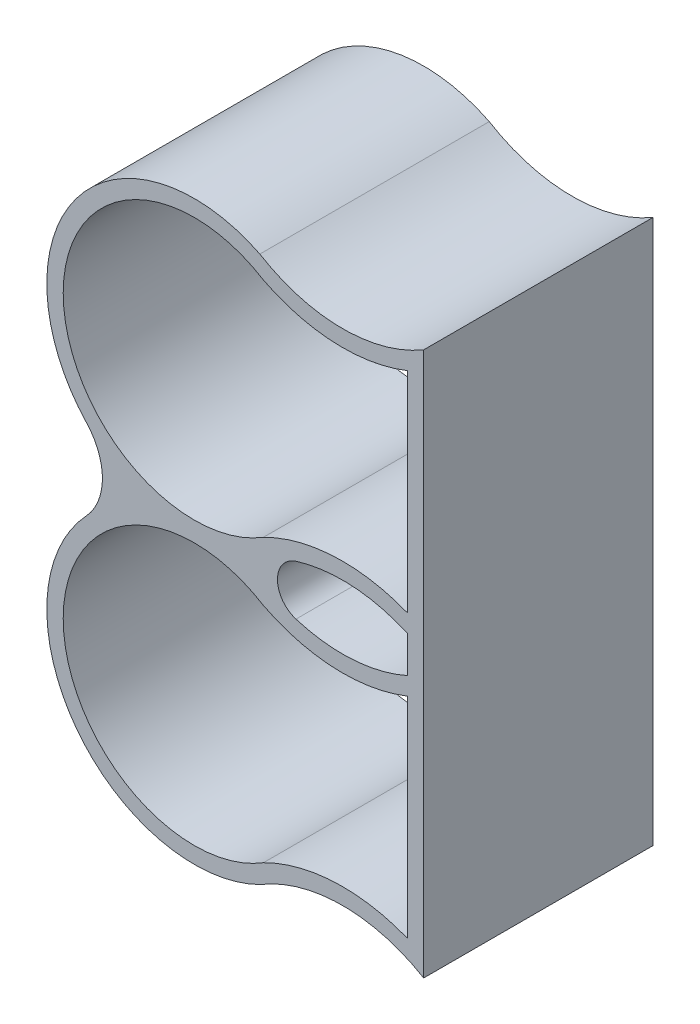
ISO-10303-21;
HEADER;
FILE_DESCRIPTION(('STEP AP214'),'2;1');
FILE_NAME('part.step','',(''),(''),'','','');
FILE_SCHEMA(('AUTOMOTIVE_DESIGN { 1 0 10303 214 1 1 1 1 }'));
ENDSEC;
DATA;
#1=APPLICATION_CONTEXT('core data for automotive mechanical design processes');
#2=APPLICATION_PROTOCOL_DEFINITION('international standard','automotive_design',2000,#1);
#3=PRODUCT_CONTEXT('',#1,'mechanical');
#4=PRODUCT('Part','Part','',(#3));
#5=PRODUCT_RELATED_PRODUCT_CATEGORY('part','',(#4));
#6=PRODUCT_DEFINITION_FORMATION('','',#4);
#7=PRODUCT_DEFINITION_CONTEXT('part definition',#1,'design');
#8=PRODUCT_DEFINITION('design','',#6,#7);
#9=PRODUCT_DEFINITION_SHAPE('','',#8);
#10=(LENGTH_UNIT() NAMED_UNIT(*) SI_UNIT(.MILLI.,.METRE.));
#11=(NAMED_UNIT(*) PLANE_ANGLE_UNIT() SI_UNIT($,.RADIAN.));
#12=(NAMED_UNIT(*) SI_UNIT($,.STERADIAN.) SOLID_ANGLE_UNIT());
#13=UNCERTAINTY_MEASURE_WITH_UNIT(LENGTH_MEASURE(1.E-05),#10,'distance_accuracy_value','');
#14=(GEOMETRIC_REPRESENTATION_CONTEXT(3) GLOBAL_UNCERTAINTY_ASSIGNED_CONTEXT((#13)) GLOBAL_UNIT_ASSIGNED_CONTEXT((#10,
#11,#12)) REPRESENTATION_CONTEXT('',''));
#15=CARTESIAN_POINT('',(0.,0.,0.));
#16=DIRECTION('',(0.,0.,1.));
#17=DIRECTION('',(1.,0.,0.));
#18=AXIS2_PLACEMENT_3D('',#15,#16,#17);
#19=CARTESIAN_POINT('',(0.,0.,88.9));
#20=DIRECTION('',(0.,0.,-1.));
#21=DIRECTION('',(-1.,0.,0.));
#22=AXIS2_PLACEMENT_3D('',#19,#20,#21);
#23=CYLINDRICAL_SURFACE('',#22,57.15);
#24=CARTESIAN_POINT('',(0.,0.,88.9));
#25=DIRECTION('',(0.,0.,1.));
#26=DIRECTION('',(1.,0.,0.));
#27=AXIS2_PLACEMENT_3D('',#24,#25,#26);
#28=CIRCLE('',#27,57.15);
#29=CARTESIAN_POINT('',(-41.767993800546,39.0071428571429,88.9));
#30=VERTEX_POINT('',#29);
#31=CARTESIAN_POINT('',(25.3999999999999,-51.1953367016959,88.9));
#32=VERTEX_POINT('',#31);
#33=EDGE_CURVE('E205',#30,#32,#28,.T.);
#34=ORIENTED_EDGE('',*,*,#33,.F.);
#35=DIRECTION('',(0.,0.,-1.));
#36=VECTOR('',#35,1.);
#37=CARTESIAN_POINT('',(-41.767993800546,39.0071428571429,88.9));
#38=LINE('',#37,#36);
#39=CARTESIAN_POINT('',(-41.767993800546,39.0071428571429,0.));
#40=VERTEX_POINT('',#39);
#41=EDGE_CURVE('E321',#30,#40,#38,.T.);
#42=ORIENTED_EDGE('',*,*,#41,.T.);
#43=CARTESIAN_POINT('',(0.,0.,0.));
#44=DIRECTION('',(0.,0.,1.));
#45=DIRECTION('',(1.,0.,0.));
#46=AXIS2_PLACEMENT_3D('',#43,#44,#45);
#47=CIRCLE('',#46,57.15);
#48=CARTESIAN_POINT('',(25.3999999999999,-51.1953367016959,0.));
#49=VERTEX_POINT('',#48);
#50=EDGE_CURVE('E261',#40,#49,#47,.T.);
#51=ORIENTED_EDGE('',*,*,#50,.T.);
#52=DIRECTION('',(0.,0.,-1.));
#53=VECTOR('',#52,1.);
#54=CARTESIAN_POINT('',(25.3999999999999,-51.1953367016959,88.9));
#55=LINE('',#54,#53);
#56=EDGE_CURVE('E317',#32,#49,#55,.T.);
#57=ORIENTED_EDGE('',*,*,#56,.F.);
#58=EDGE_LOOP('',(#34,#42,#51,#57));
#59=FACE_BOUND('',#58,.T.);
#60=ADVANCED_FACE('F45',(#59),#23,.T.);
#61=CARTESIAN_POINT('',(57.478649433239,-103.786187406015,88.9));
#62=DIRECTION('',(0.,0.,-1.));
#63=DIRECTION('',(-1.,0.,0.));
#64=AXIS2_PLACEMENT_3D('',#61,#62,#63);
#65=CYLINDRICAL_SURFACE('',#64,61.6022509918642);
#66=CARTESIAN_POINT('',(57.478649433239,-103.786187406015,0.));
#67=DIRECTION('',(0.,0.,1.));
#68=DIRECTION('',(1.,0.,0.));
#69=AXIS2_PLACEMENT_3D('',#66,#67,#68);
#70=CIRCLE('',#69,61.6022509918642);
#71=CARTESIAN_POINT('',(88.9,-50.8,0.));
#72=VERTEX_POINT('',#71);
#73=EDGE_CURVE('E264',#49,#72,#70,.F.);
#74=ORIENTED_EDGE('',*,*,#73,.T.);
#75=DIRECTION('',(0.,0.,-1.));
#76=VECTOR('',#75,1.);
#77=CARTESIAN_POINT('',(88.9,-50.8,88.9));
#78=LINE('',#77,#76);
#79=CARTESIAN_POINT('',(88.9,-50.8,88.9));
#80=VERTEX_POINT('',#79);
#81=EDGE_CURVE('E314',#80,#72,#78,.T.);
#82=ORIENTED_EDGE('',*,*,#81,.F.);
#83=CARTESIAN_POINT('',(57.478649433239,-103.786187406015,88.9));
#84=DIRECTION('',(0.,0.,1.));
#85=DIRECTION('',(1.,0.,0.));
#86=AXIS2_PLACEMENT_3D('',#83,#84,#85);
#87=CIRCLE('',#86,61.6022509918642);
#88=EDGE_CURVE('E208',#32,#80,#87,.F.);
#89=ORIENTED_EDGE('',*,*,#88,.F.);
#90=ORIENTED_EDGE('',*,*,#56,.T.);
#91=EDGE_LOOP('',(#74,#82,#89,#90));
#92=FACE_BOUND('',#91,.T.);
#93=ADVANCED_FACE('F395',(#92),#65,.F.);
#94=CARTESIAN_POINT('',(88.9,0.,88.9));
#95=DIRECTION('',(1.,0.,0.));
#96=DIRECTION('',(0.,0.,-1.));
#97=AXIS2_PLACEMENT_3D('',#94,#95,#96);
#98=PLANE('',#97);
#99=DIRECTION('',(0.,-1.,0.));
#100=VECTOR('',#99,1.);
#101=CARTESIAN_POINT('',(88.9,0.,0.));
#102=LINE('',#101,#100);
#103=CARTESIAN_POINT('',(88.9,160.02,0.));
#104=VERTEX_POINT('',#103);
#105=EDGE_CURVE('E299',#104,#72,#102,.T.);
#106=ORIENTED_EDGE('',*,*,#105,.F.);
#107=DIRECTION('',(0.,0.,-1.));
#108=VECTOR('',#107,1.);
#109=CARTESIAN_POINT('',(88.9,160.02,88.9));
#110=LINE('',#109,#108);
#111=CARTESIAN_POINT('',(88.9,160.02,88.9));
#112=VERTEX_POINT('',#111);
#113=EDGE_CURVE('E310',#112,#104,#110,.T.);
#114=ORIENTED_EDGE('',*,*,#113,.F.);
#115=DIRECTION('',(0.,-1.,0.));
#116=VECTOR('',#115,1.);
#117=CARTESIAN_POINT('',(88.9,0.,88.9));
#118=LINE('',#117,#116);
#119=EDGE_CURVE('E240',#112,#80,#118,.T.);
#120=ORIENTED_EDGE('',*,*,#119,.T.);
#121=ORIENTED_EDGE('',*,*,#81,.T.);
#122=EDGE_LOOP('',(#106,#114,#120,#121));
#123=FACE_BOUND('',#122,.T.);
#124=ADVANCED_FACE('F383',(#123),#98,.T.);
#125=CARTESIAN_POINT('',(57.4786494332389,213.006187406015,88.9));
#126=DIRECTION('',(0.,0.,-1.));
#127=DIRECTION('',(-1.,0.,0.));
#128=AXIS2_PLACEMENT_3D('',#125,#126,#127);
#129=CYLINDRICAL_SURFACE('',#128,61.6022509918642);
#130=CARTESIAN_POINT('',(57.4786494332389,213.006187406015,0.));
#131=DIRECTION('',(0.,0.,1.));
#132=DIRECTION('',(1.,0.,0.));
#133=AXIS2_PLACEMENT_3D('',#130,#131,#132);
#134=CIRCLE('',#133,61.6022509918642);
#135=CARTESIAN_POINT('',(25.4,160.415336701696,0.));
#136=VERTEX_POINT('',#135);
#137=EDGE_CURVE('E251',#136,#104,#134,.T.);
#138=ORIENTED_EDGE('',*,*,#137,.F.);
#139=DIRECTION('',(0.,0.,-1.));
#140=VECTOR('',#139,1.);
#141=CARTESIAN_POINT('',(25.4,160.415336701696,88.9));
#142=LINE('',#141,#140);
#143=CARTESIAN_POINT('',(25.4,160.415336701696,88.9));
#144=VERTEX_POINT('',#143);
#145=EDGE_CURVE('E306',#144,#136,#142,.T.);
#146=ORIENTED_EDGE('',*,*,#145,.F.);
#147=CARTESIAN_POINT('',(57.4786494332389,213.006187406015,88.9));
#148=DIRECTION('',(0.,0.,1.));
#149=DIRECTION('',(1.,0.,0.));
#150=AXIS2_PLACEMENT_3D('',#147,#148,#149);
#151=CIRCLE('',#150,61.6022509918642);
#152=EDGE_CURVE('E244',#144,#112,#151,.T.);
#153=ORIENTED_EDGE('',*,*,#152,.T.);
#154=ORIENTED_EDGE('',*,*,#113,.T.);
#155=EDGE_LOOP('',(#138,#146,#153,#154));
#156=FACE_BOUND('',#155,.T.);
#157=ADVANCED_FACE('F377',(#156),#129,.F.);
#158=CARTESIAN_POINT('',(57.478649433239,-103.786187406015,88.9));
#159=DIRECTION('',(0.,0.,-1.));
#160=DIRECTION('',(-1.,0.,0.));
#161=AXIS2_PLACEMENT_3D('',#158,#159,#160);
#162=CYLINDRICAL_SURFACE('',#161,67.9522509918642);
#163=CARTESIAN_POINT('',(57.478649433239,-103.786187406015,0.));
#164=DIRECTION('',(0.,0.,1.));
#165=DIRECTION('',(1.,0.,0.));
#166=AXIS2_PLACEMENT_3D('',#163,#164,#165);
#167=CIRCLE('',#166,67.9522509918642);
#168=CARTESIAN_POINT('',(26.8180328127659,-43.1443288979376,0.));
#169=VERTEX_POINT('',#168);
#170=CARTESIAN_POINT('',(82.55,-40.6281649890656,0.));
#171=VERTEX_POINT('',#170);
#172=EDGE_CURVE('E281',#169,#171,#167,.F.);
#173=ORIENTED_EDGE('',*,*,#172,.F.);
#174=DIRECTION('',(0.,0.,-1.));
#175=VECTOR('',#174,1.);
#176=CARTESIAN_POINT('',(26.8180328127659,-43.1443288979376,88.9));
#177=LINE('',#176,#175);
#178=CARTESIAN_POINT('',(26.8180328127659,-43.1443288979376,88.9));
#179=VERTEX_POINT('',#178);
#180=EDGE_CURVE('E311',#179,#169,#177,.T.);
#181=ORIENTED_EDGE('',*,*,#180,.F.);
#182=CARTESIAN_POINT('',(57.478649433239,-103.786187406015,88.9));
#183=DIRECTION('',(0.,0.,1.));
#184=DIRECTION('',(1.,0.,0.));
#185=AXIS2_PLACEMENT_3D('',#182,#183,#184);
#186=CIRCLE('',#185,67.9522509918642);
#187=CARTESIAN_POINT('',(82.55,-40.6281649890656,88.9));
#188=VERTEX_POINT('',#187);
#189=EDGE_CURVE('E224',#179,#188,#186,.F.);
#190=ORIENTED_EDGE('',*,*,#189,.T.);
#191=DIRECTION('',(0.,0.,-1.));
#192=VECTOR('',#191,1.);
#193=CARTESIAN_POINT('',(82.55,-40.6281649890656,88.9));
#194=LINE('',#193,#192);
#195=EDGE_CURVE('E322',#188,#171,#194,.T.);
#196=ORIENTED_EDGE('',*,*,#195,.T.);
#197=EDGE_LOOP('',(#173,#181,#190,#196));
#198=FACE_BOUND('',#197,.T.);
#199=ADVANCED_FACE('F420',(#198),#162,.T.);
#200=CARTESIAN_POINT('',(0.,0.,88.9));
#201=DIRECTION('',(0.,0.,-1.));
#202=DIRECTION('',(-1.,0.,0.));
#203=AXIS2_PLACEMENT_3D('',#200,#201,#202);
#204=CYLINDRICAL_SURFACE('',#203,50.8);
#205=CARTESIAN_POINT('',(0.,0.,0.));
#206=DIRECTION('',(0.,0.,1.));
#207=DIRECTION('',(1.,0.,0.));
#208=AXIS2_PLACEMENT_3D('',#205,#206,#207);
#209=CIRCLE('',#208,50.8);
#210=CARTESIAN_POINT('',(26.8180328127659,43.1443288979376,0.));
#211=VERTEX_POINT('',#210);
#212=EDGE_CURVE('E285',#211,#169,#209,.T.);
#213=ORIENTED_EDGE('',*,*,#212,.F.);
#214=DIRECTION('',(0.,0.,-1.));
#215=VECTOR('',#214,1.);
#216=CARTESIAN_POINT('',(26.8180328127659,43.1443288979376,88.9));
#217=LINE('',#216,#215);
#218=CARTESIAN_POINT('',(26.8180328127659,43.1443288979376,88.9));
#219=VERTEX_POINT('',#218);
#220=EDGE_CURVE('E330',#219,#211,#217,.T.);
#221=ORIENTED_EDGE('',*,*,#220,.F.);
#222=CARTESIAN_POINT('',(0.,0.,88.9));
#223=DIRECTION('',(0.,0.,1.));
#224=DIRECTION('',(1.,0.,0.));
#225=AXIS2_PLACEMENT_3D('',#222,#223,#224);
#226=CIRCLE('',#225,50.8);
#227=EDGE_CURVE('E228',#219,#179,#226,.T.);
#228=ORIENTED_EDGE('',*,*,#227,.T.);
#229=ORIENTED_EDGE('',*,*,#180,.T.);
#230=EDGE_LOOP('',(#213,#221,#228,#229));
#231=FACE_BOUND('',#230,.T.);
#232=ADVANCED_FACE('F416',(#231),#204,.F.);
#233=CARTESIAN_POINT('',(57.478649433239,103.786187406015,88.9));
#234=DIRECTION('',(0.,0.,-1.));
#235=DIRECTION('',(-1.,0.,0.));
#236=AXIS2_PLACEMENT_3D('',#233,#234,#235);
#237=CYLINDRICAL_SURFACE('',#236,67.9522509918642);
#238=CARTESIAN_POINT('',(57.478649433239,103.786187406015,0.));
#239=DIRECTION('',(0.,0.,1.));
#240=DIRECTION('',(1.,0.,0.));
#241=AXIS2_PLACEMENT_3D('',#238,#239,#240);
#242=CIRCLE('',#241,67.9522509918642);
#243=CARTESIAN_POINT('',(82.55,40.6281649890656,0.));
#244=VERTEX_POINT('',#243);
#245=EDGE_CURVE('E289',#211,#244,#242,.T.);
#246=ORIENTED_EDGE('',*,*,#245,.T.);
#247=DIRECTION('',(0.,0.,-1.));
#248=VECTOR('',#247,1.);
#249=CARTESIAN_POINT('',(82.55,40.6281649890656,88.9));
#250=LINE('',#249,#248);
#251=CARTESIAN_POINT('',(82.55,40.6281649890656,88.9));
#252=VERTEX_POINT('',#251);
#253=EDGE_CURVE('E325',#252,#244,#250,.T.);
#254=ORIENTED_EDGE('',*,*,#253,.F.);
#255=CARTESIAN_POINT('',(57.478649433239,103.786187406015,88.9));
#256=DIRECTION('',(0.,0.,1.));
#257=DIRECTION('',(1.,0.,0.));
#258=AXIS2_PLACEMENT_3D('',#255,#256,#257);
#259=CIRCLE('',#258,67.9522509918642);
#260=EDGE_CURVE('E232',#219,#252,#259,.T.);
#261=ORIENTED_EDGE('',*,*,#260,.F.);
#262=ORIENTED_EDGE('',*,*,#220,.T.);
#263=EDGE_LOOP('',(#246,#254,#261,#262));
#264=FACE_BOUND('',#263,.T.);
#265=ADVANCED_FACE('F412',(#264),#237,.T.);
#266=CARTESIAN_POINT('',(0.,109.22,88.9));
#267=DIRECTION('',(0.,0.,-1.));
#268=DIRECTION('',(-1.,0.,0.));
#269=AXIS2_PLACEMENT_3D('',#266,#267,#268);
#270=CYLINDRICAL_SURFACE('',#269,50.8);
#271=CARTESIAN_POINT('',(0.,109.22,0.));
#272=DIRECTION('',(0.,0.,1.));
#273=DIRECTION('',(1.,0.,0.));
#274=AXIS2_PLACEMENT_3D('',#271,#272,#273);
#275=CIRCLE('',#274,50.8);
#276=CARTESIAN_POINT('',(26.8180328127658,66.0756711020624,0.));
#277=VERTEX_POINT('',#276);
#278=CARTESIAN_POINT('',(26.8180328127655,152.364328897938,0.));
#279=VERTEX_POINT('',#278);
#280=EDGE_CURVE('E260',#277,#279,#275,.F.);
#281=ORIENTED_EDGE('',*,*,#280,.T.);
#282=DIRECTION('',(0.,0.,-1.));
#283=VECTOR('',#282,1.);
#284=CARTESIAN_POINT('',(26.8180328127655,152.364328897938,88.9));
#285=LINE('',#284,#283);
#286=CARTESIAN_POINT('',(26.8180328127655,152.364328897938,88.9));
#287=VERTEX_POINT('',#286);
#288=EDGE_CURVE('E326',#287,#279,#285,.T.);
#289=ORIENTED_EDGE('',*,*,#288,.F.);
#290=CARTESIAN_POINT('',(0.,109.22,88.9));
#291=DIRECTION('',(0.,0.,1.));
#292=DIRECTION('',(1.,0.,0.));
#293=AXIS2_PLACEMENT_3D('',#290,#291,#292);
#294=CIRCLE('',#293,50.8);
#295=CARTESIAN_POINT('',(26.8180328127658,66.0756711020624,88.9));
#296=VERTEX_POINT('',#295);
#297=EDGE_CURVE('E201',#296,#287,#294,.F.);
#298=ORIENTED_EDGE('',*,*,#297,.F.);
#299=DIRECTION('',(0.,0.,-1.));
#300=VECTOR('',#299,1.);
#301=CARTESIAN_POINT('',(26.8180328127658,66.0756711020624,88.9));
#302=LINE('',#301,#300);
#303=EDGE_CURVE('E192',#296,#277,#302,.T.);
#304=ORIENTED_EDGE('',*,*,#303,.T.);
#305=EDGE_LOOP('',(#281,#289,#298,#304));
#306=FACE_BOUND('',#305,.T.);
#307=ADVANCED_FACE('F415',(#306),#270,.F.);
#308=CARTESIAN_POINT('',(57.4786494332389,213.006187406015,88.9));
#309=DIRECTION('',(0.,0.,-1.));
#310=DIRECTION('',(-1.,0.,0.));
#311=AXIS2_PLACEMENT_3D('',#308,#309,#310);
#312=CYLINDRICAL_SURFACE('',#311,67.9522509918642);
#313=CARTESIAN_POINT('',(57.4786494332389,213.006187406015,0.));
#314=DIRECTION('',(0.,0.,1.));
#315=DIRECTION('',(1.,0.,0.));
#316=AXIS2_PLACEMENT_3D('',#313,#314,#315);
#317=CIRCLE('',#316,67.9522509918642);
#318=CARTESIAN_POINT('',(82.55,149.848164989066,0.));
#319=VERTEX_POINT('',#318);
#320=EDGE_CURVE('E269',#279,#319,#317,.T.);
#321=ORIENTED_EDGE('',*,*,#320,.T.);
#322=DIRECTION('',(0.,0.,-1.));
#323=VECTOR('',#322,1.);
#324=CARTESIAN_POINT('',(82.55,149.848164989066,88.9));
#325=LINE('',#324,#323);
#326=CARTESIAN_POINT('',(82.55,149.848164989066,88.9));
#327=VERTEX_POINT('',#326);
#328=EDGE_CURVE('E340',#327,#319,#325,.T.);
#329=ORIENTED_EDGE('',*,*,#328,.F.);
#330=CARTESIAN_POINT('',(57.4786494332389,213.006187406015,88.9));
#331=DIRECTION('',(0.,0.,1.));
#332=DIRECTION('',(1.,0.,0.));
#333=AXIS2_PLACEMENT_3D('',#330,#331,#332);
#334=CIRCLE('',#333,67.9522509918642);
#335=EDGE_CURVE('E213',#287,#327,#334,.T.);
#336=ORIENTED_EDGE('',*,*,#335,.F.);
#337=ORIENTED_EDGE('',*,*,#288,.T.);
#338=EDGE_LOOP('',(#321,#329,#336,#337));
#339=FACE_BOUND('',#338,.T.);
#340=ADVANCED_FACE('F431',(#339),#312,.T.);
#341=CARTESIAN_POINT('',(82.55,0.,88.9));
#342=DIRECTION('',(-1.,0.,0.));
#343=DIRECTION('',(0.,-1.,0.));
#344=AXIS2_PLACEMENT_3D('',#341,#342,#343);
#345=PLANE('',#344);
#346=DIRECTION('',(0.,1.,0.));
#347=VECTOR('',#346,1.);
#348=CARTESIAN_POINT('',(82.55,0.,0.));
#349=LINE('',#348,#347);
#350=CARTESIAN_POINT('',(82.55,68.5918350109344,0.));
#351=VERTEX_POINT('',#350);
#352=EDGE_CURVE('E273',#351,#319,#349,.T.);
#353=ORIENTED_EDGE('',*,*,#352,.F.);
#354=DIRECTION('',(0.,0.,-1.));
#355=VECTOR('',#354,1.);
#356=CARTESIAN_POINT('',(82.55,68.5918350109344,88.9));
#357=LINE('',#356,#355);
#358=CARTESIAN_POINT('',(82.55,68.5918350109344,88.9));
#359=VERTEX_POINT('',#358);
#360=EDGE_CURVE('E337',#359,#351,#357,.T.);
#361=ORIENTED_EDGE('',*,*,#360,.F.);
#362=DIRECTION('',(0.,1.,0.));
#363=VECTOR('',#362,1.);
#364=CARTESIAN_POINT('',(82.55,0.,88.9));
#365=LINE('',#364,#363);
#366=EDGE_CURVE('E216',#359,#327,#365,.T.);
#367=ORIENTED_EDGE('',*,*,#366,.T.);
#368=ORIENTED_EDGE('',*,*,#328,.T.);
#369=EDGE_LOOP('',(#353,#361,#367,#368));
#370=FACE_BOUND('',#369,.T.);
#371=ADVANCED_FACE('F428',(#370),#345,.T.);
#372=CARTESIAN_POINT('',(57.478649433239,5.43381259398508,88.9));
#373=DIRECTION('',(0.,0.,-1.));
#374=DIRECTION('',(-1.,0.,0.));
#375=AXIS2_PLACEMENT_3D('',#372,#373,#374);
#376=CYLINDRICAL_SURFACE('',#375,61.6022509918642);
#377=CARTESIAN_POINT('',(57.478649433239,5.43381259398508,88.9));
#378=DIRECTION('',(0.,0.,1.));
#379=DIRECTION('',(1.,0.,0.));
#380=AXIS2_PLACEMENT_3D('',#377,#378,#379);
#381=CIRCLE('',#380,61.6022509918642);
#382=CARTESIAN_POINT('',(39.3964418652691,64.3224455950447,88.9));
#383=VERTEX_POINT('',#382);
#384=CARTESIAN_POINT('',(82.55,61.7033843714849,88.9));
#385=VERTEX_POINT('',#384);
#386=EDGE_CURVE('E170',#383,#385,#381,.F.);
#387=ORIENTED_EDGE('',*,*,#386,.F.);
#388=DIRECTION('',(0.,0.,-1.));
#389=VECTOR('',#388,1.);
#390=CARTESIAN_POINT('',(39.3964418652691,64.3224455950447,88.9));
#391=LINE('',#390,#389);
#392=CARTESIAN_POINT('',(39.3964418652691,64.3224455950447,0.));
#393=VERTEX_POINT('',#392);
#394=EDGE_CURVE('E360',#383,#393,#391,.T.);
#395=ORIENTED_EDGE('',*,*,#394,.T.);
#396=CARTESIAN_POINT('',(57.478649433239,5.43381259398508,0.));
#397=DIRECTION('',(0.,0.,1.));
#398=DIRECTION('',(1.,0.,0.));
#399=AXIS2_PLACEMENT_3D('',#396,#397,#398);
#400=CIRCLE('',#399,61.6022509918642);
#401=CARTESIAN_POINT('',(82.55,61.7033843714849,0.));
#402=VERTEX_POINT('',#401);
#403=EDGE_CURVE('E187',#393,#402,#400,.F.);
#404=ORIENTED_EDGE('',*,*,#403,.T.);
#405=DIRECTION('',(0.,0.,-1.));
#406=VECTOR('',#405,1.);
#407=CARTESIAN_POINT('',(82.55,61.7033843714849,88.9));
#408=LINE('',#407,#406);
#409=EDGE_CURVE('E185',#385,#402,#408,.T.);
#410=ORIENTED_EDGE('',*,*,#409,.F.);
#411=EDGE_LOOP('',(#387,#395,#404,#410));
#412=FACE_BOUND('',#411,.T.);
#413=ADVANCED_FACE('F186',(#412),#376,.F.);
#414=CARTESIAN_POINT('',(82.55,0.,88.9));
#415=DIRECTION('',(1.,0.,0.));
#416=DIRECTION('',(0.,0.,-1.));
#417=AXIS2_PLACEMENT_3D('',#414,#415,#416);
#418=PLANE('',#417);
#419=DIRECTION('',(0.,-1.,0.));
#420=VECTOR('',#419,1.);
#421=CARTESIAN_POINT('',(82.55,0.,0.));
#422=LINE('',#421,#420);
#423=CARTESIAN_POINT('',(82.55,47.5166156285151,0.));
#424=VERTEX_POINT('',#423);
#425=EDGE_CURVE('E254',#402,#424,#422,.T.);
#426=ORIENTED_EDGE('',*,*,#425,.T.);
#427=DIRECTION('',(0.,0.,-1.));
#428=VECTOR('',#427,1.);
#429=CARTESIAN_POINT('',(82.55,47.5166156285151,88.9));
#430=LINE('',#429,#428);
#431=CARTESIAN_POINT('',(82.55,47.5166156285151,88.9));
#432=VERTEX_POINT('',#431);
#433=EDGE_CURVE('E193',#432,#424,#430,.T.);
#434=ORIENTED_EDGE('',*,*,#433,.F.);
#435=DIRECTION('',(0.,-1.,0.));
#436=VECTOR('',#435,1.);
#437=CARTESIAN_POINT('',(82.55,0.,88.9));
#438=LINE('',#437,#436);
#439=EDGE_CURVE('E175',#385,#432,#438,.T.);
#440=ORIENTED_EDGE('',*,*,#439,.F.);
#441=ORIENTED_EDGE('',*,*,#409,.T.);
#442=EDGE_LOOP('',(#426,#434,#440,#441));
#443=FACE_BOUND('',#442,.T.);
#444=ADVANCED_FACE('F195',(#443),#418,.F.);
#445=CARTESIAN_POINT('',(57.478649433239,103.786187406015,88.9));
#446=DIRECTION('',(0.,0.,-1.));
#447=DIRECTION('',(-1.,0.,0.));
#448=AXIS2_PLACEMENT_3D('',#445,#446,#447);
#449=CYLINDRICAL_SURFACE('',#448,61.6022509918642);
#450=CARTESIAN_POINT('',(57.478649433239,103.786187406015,0.));
#451=DIRECTION('',(0.,0.,1.));
#452=DIRECTION('',(1.,0.,0.));
#453=AXIS2_PLACEMENT_3D('',#450,#451,#452);
#454=CIRCLE('',#453,61.6022509918642);
#455=CARTESIAN_POINT('',(39.3964418652691,44.8975544049554,0.));
#456=VERTEX_POINT('',#455);
#457=EDGE_CURVE('E257',#456,#424,#454,.T.);
#458=ORIENTED_EDGE('',*,*,#457,.F.);
#459=DIRECTION('',(0.,0.,-1.));
#460=VECTOR('',#459,1.);
#461=CARTESIAN_POINT('',(39.3964418652691,44.8975544049554,88.9));
#462=LINE('',#461,#460);
#463=CARTESIAN_POINT('',(39.3964418652691,44.8975544049554,88.9));
#464=VERTEX_POINT('',#463);
#465=EDGE_CURVE('E61',#456,#464,#462,.F.);
#466=ORIENTED_EDGE('',*,*,#465,.T.);
#467=CARTESIAN_POINT('',(57.478649433239,103.786187406015,88.9));
#468=DIRECTION('',(0.,0.,1.));
#469=DIRECTION('',(1.,0.,0.));
#470=AXIS2_PLACEMENT_3D('',#467,#468,#469);
#471=CIRCLE('',#470,61.6022509918642);
#472=EDGE_CURVE('E198',#464,#432,#471,.T.);
#473=ORIENTED_EDGE('',*,*,#472,.T.);
#474=ORIENTED_EDGE('',*,*,#433,.T.);
#475=EDGE_LOOP('',(#458,#466,#473,#474));
#476=FACE_BOUND('',#475,.T.);
#477=ADVANCED_FACE('F410',(#476),#449,.F.);
#478=CARTESIAN_POINT('',(82.55,0.,88.9));
#479=DIRECTION('',(1.,0.,0.));
#480=DIRECTION('',(0.,0.,-1.));
#481=AXIS2_PLACEMENT_3D('',#478,#479,#480);
#482=PLANE('',#481);
#483=DIRECTION('',(0.,-1.,0.));
#484=VECTOR('',#483,1.);
#485=CARTESIAN_POINT('',(82.55,0.,0.));
#486=LINE('',#485,#484);
#487=EDGE_CURVE('E265',#244,#171,#486,.T.);
#488=ORIENTED_EDGE('',*,*,#487,.T.);
#489=ORIENTED_EDGE('',*,*,#195,.F.);
#490=DIRECTION('',(0.,-1.,0.));
#491=VECTOR('',#490,1.);
#492=CARTESIAN_POINT('',(82.55,0.,88.9));
#493=LINE('',#492,#491);
#494=EDGE_CURVE('E209',#252,#188,#493,.T.);
#495=ORIENTED_EDGE('',*,*,#494,.F.);
#496=ORIENTED_EDGE('',*,*,#253,.T.);
#497=EDGE_LOOP('',(#488,#489,#495,#496));
#498=FACE_BOUND('',#497,.T.);
#499=ADVANCED_FACE('F406',(#498),#482,.F.);
#500=CARTESIAN_POINT('',(57.478649433239,5.43381259398508,88.9));
#501=DIRECTION('',(0.,0.,-1.));
#502=DIRECTION('',(-1.,0.,0.));
#503=AXIS2_PLACEMENT_3D('',#500,#501,#502);
#504=CYLINDRICAL_SURFACE('',#503,67.9522509918642);
#505=CARTESIAN_POINT('',(57.478649433239,5.43381259398508,0.));
#506=DIRECTION('',(0.,0.,1.));
#507=DIRECTION('',(1.,0.,0.));
#508=AXIS2_PLACEMENT_3D('',#505,#506,#507);
#509=CIRCLE('',#508,67.9522509918642);
#510=EDGE_CURVE('E277',#277,#351,#509,.F.);
#511=ORIENTED_EDGE('',*,*,#510,.F.);
#512=ORIENTED_EDGE('',*,*,#303,.F.);
#513=CARTESIAN_POINT('',(57.478649433239,5.43381259398508,88.9));
#514=DIRECTION('',(0.,0.,1.));
#515=DIRECTION('',(1.,0.,0.));
#516=AXIS2_PLACEMENT_3D('',#513,#514,#515);
#517=CIRCLE('',#516,67.9522509918642);
#518=EDGE_CURVE('E220',#296,#359,#517,.F.);
#519=ORIENTED_EDGE('',*,*,#518,.T.);
#520=ORIENTED_EDGE('',*,*,#360,.T.);
#521=EDGE_LOOP('',(#511,#512,#519,#520));
#522=FACE_BOUND('',#521,.T.);
#523=ADVANCED_FACE('F409',(#522),#504,.T.);
#524=CARTESIAN_POINT('',(0.,109.22,88.9));
#525=DIRECTION('',(0.,0.,-1.));
#526=DIRECTION('',(-1.,0.,0.));
#527=AXIS2_PLACEMENT_3D('',#524,#525,#526);
#528=CYLINDRICAL_SURFACE('',#527,57.15);
#529=CARTESIAN_POINT('',(0.,109.22,0.));
#530=DIRECTION('',(0.,0.,1.));
#531=DIRECTION('',(1.,0.,0.));
#532=AXIS2_PLACEMENT_3D('',#529,#530,#531);
#533=CIRCLE('',#532,57.15);
#534=CARTESIAN_POINT('',(-41.767993800546,70.2128571428571,0.));
#535=VERTEX_POINT('',#534);
#536=EDGE_CURVE('E182',#535,#136,#533,.F.);
#537=ORIENTED_EDGE('',*,*,#536,.F.);
#538=DIRECTION('',(0.,0.,-1.));
#539=VECTOR('',#538,1.);
#540=CARTESIAN_POINT('',(-41.767993800546,70.2128571428571,88.9));
#541=LINE('',#540,#539);
#542=CARTESIAN_POINT('',(-41.767993800546,70.2128571428571,88.9));
#543=VERTEX_POINT('',#542);
#544=EDGE_CURVE('E351',#535,#543,#541,.F.);
#545=ORIENTED_EDGE('',*,*,#544,.T.);
#546=CARTESIAN_POINT('',(0.,109.22,88.9));
#547=DIRECTION('',(0.,0.,1.));
#548=DIRECTION('',(1.,0.,0.));
#549=AXIS2_PLACEMENT_3D('',#546,#547,#548);
#550=CIRCLE('',#549,57.15);
#551=EDGE_CURVE('E248',#543,#144,#550,.F.);
#552=ORIENTED_EDGE('',*,*,#551,.T.);
#553=ORIENTED_EDGE('',*,*,#145,.T.);
#554=EDGE_LOOP('',(#537,#545,#552,#553));
#555=FACE_BOUND('',#554,.T.);
#556=ADVANCED_FACE('F370',(#555),#528,.T.);
#557=CARTESIAN_POINT('',(0.,0.,88.9));
#558=DIRECTION('',(0.,0.,1.));
#559=DIRECTION('',(1.,0.,0.));
#560=AXIS2_PLACEMENT_3D('',#557,#558,#559);
#561=PLANE('',#560);
#562=ORIENTED_EDGE('',*,*,#472,.F.);
#563=CARTESIAN_POINT('',(42.3787229659197,54.61,88.9));
#564=DIRECTION('',(0.,0.,1.));
#565=DIRECTION('',(1.,0.,0.));
#566=AXIS2_PLACEMENT_3D('',#563,#564,#565);
#567=CIRCLE('',#566,10.16);
#568=EDGE_CURVE('E11',#464,#383,#567,.F.);
#569=ORIENTED_EDGE('',*,*,#568,.T.);
#570=ORIENTED_EDGE('',*,*,#386,.T.);
#571=ORIENTED_EDGE('',*,*,#439,.T.);
#572=EDGE_LOOP('',(#562,#569,#570,#571));
#573=FACE_BOUND('',#572,.T.);
#574=ORIENTED_EDGE('',*,*,#297,.T.);
#575=ORIENTED_EDGE('',*,*,#335,.T.);
#576=ORIENTED_EDGE('',*,*,#366,.F.);
#577=ORIENTED_EDGE('',*,*,#518,.F.);
#578=EDGE_LOOP('',(#574,#575,#576,#577));
#579=FACE_BOUND('',#578,.T.);
#580=ORIENTED_EDGE('',*,*,#189,.F.);
#581=ORIENTED_EDGE('',*,*,#227,.F.);
#582=ORIENTED_EDGE('',*,*,#260,.T.);
#583=ORIENTED_EDGE('',*,*,#494,.T.);
#584=EDGE_LOOP('',(#580,#581,#582,#583));
#585=FACE_BOUND('',#584,.T.);
#586=ORIENTED_EDGE('',*,*,#551,.F.);
#587=CARTESIAN_POINT('',(-58.4751913207644,54.61,88.9));
#588=DIRECTION('',(0.,0.,1.));
#589=DIRECTION('',(1.,0.,0.));
#590=AXIS2_PLACEMENT_3D('',#587,#588,#589);
#591=CIRCLE('',#590,22.86);
#592=EDGE_CURVE('E357',#543,#30,#591,.F.);
#593=ORIENTED_EDGE('',*,*,#592,.T.);
#594=ORIENTED_EDGE('',*,*,#33,.T.);
#595=ORIENTED_EDGE('',*,*,#88,.T.);
#596=ORIENTED_EDGE('',*,*,#119,.F.);
#597=ORIENTED_EDGE('',*,*,#152,.F.);
#598=EDGE_LOOP('',(#586,#593,#594,#595,#596,#597));
#599=FACE_BOUND('',#598,.T.);
#600=ADVANCED_FACE('F172',(#573,#579,#585,#599),#561,.T.);
#601=CARTESIAN_POINT('',(0.,0.,0.));
#602=DIRECTION('',(0.,0.,1.));
#603=DIRECTION('',(1.,0.,0.));
#604=AXIS2_PLACEMENT_3D('',#601,#602,#603);
#605=PLANE('',#604);
#606=ORIENTED_EDGE('',*,*,#403,.F.);
#607=CARTESIAN_POINT('',(42.3787229659197,54.61,0.));
#608=DIRECTION('',(0.,0.,1.));
#609=DIRECTION('',(1.,0.,0.));
#610=AXIS2_PLACEMENT_3D('',#607,#608,#609);
#611=CIRCLE('',#610,10.16);
#612=EDGE_CURVE('E54',#393,#456,#611,.T.);
#613=ORIENTED_EDGE('',*,*,#612,.T.);
#614=ORIENTED_EDGE('',*,*,#457,.T.);
#615=ORIENTED_EDGE('',*,*,#425,.F.);
#616=EDGE_LOOP('',(#606,#613,#614,#615));
#617=FACE_BOUND('',#616,.T.);
#618=ORIENTED_EDGE('',*,*,#280,.F.);
#619=ORIENTED_EDGE('',*,*,#510,.T.);
#620=ORIENTED_EDGE('',*,*,#352,.T.);
#621=ORIENTED_EDGE('',*,*,#320,.F.);
#622=EDGE_LOOP('',(#618,#619,#620,#621));
#623=FACE_BOUND('',#622,.T.);
#624=ORIENTED_EDGE('',*,*,#172,.T.);
#625=ORIENTED_EDGE('',*,*,#487,.F.);
#626=ORIENTED_EDGE('',*,*,#245,.F.);
#627=ORIENTED_EDGE('',*,*,#212,.T.);
#628=EDGE_LOOP('',(#624,#625,#626,#627));
#629=FACE_BOUND('',#628,.T.);
#630=ORIENTED_EDGE('',*,*,#50,.F.);
#631=CARTESIAN_POINT('',(-58.4751913207644,54.61,0.));
#632=DIRECTION('',(0.,0.,1.));
#633=DIRECTION('',(1.,0.,0.));
#634=AXIS2_PLACEMENT_3D('',#631,#632,#633);
#635=CIRCLE('',#634,22.86);
#636=EDGE_CURVE('E354',#40,#535,#635,.T.);
#637=ORIENTED_EDGE('',*,*,#636,.T.);
#638=ORIENTED_EDGE('',*,*,#536,.T.);
#639=ORIENTED_EDGE('',*,*,#137,.T.);
#640=ORIENTED_EDGE('',*,*,#105,.T.);
#641=ORIENTED_EDGE('',*,*,#73,.F.);
#642=EDGE_LOOP('',(#630,#637,#638,#639,#640,#641));
#643=FACE_BOUND('',#642,.T.);
#644=ADVANCED_FACE('F387',(#617,#623,#629,#643),#605,.F.);
#645=CARTESIAN_POINT('',(-58.4751913207644,54.61,88.9));
#646=DIRECTION('',(0.,0.,1.));
#647=DIRECTION('',(1.,0.,0.));
#648=AXIS2_PLACEMENT_3D('',#645,#646,#647);
#649=CYLINDRICAL_SURFACE('',#648,22.86);
#650=ORIENTED_EDGE('',*,*,#592,.F.);
#651=ORIENTED_EDGE('',*,*,#544,.F.);
#652=ORIENTED_EDGE('',*,*,#636,.F.);
#653=ORIENTED_EDGE('',*,*,#41,.F.);
#654=EDGE_LOOP('',(#650,#651,#652,#653));
#655=FACE_BOUND('',#654,.T.);
#656=ADVANCED_FACE('F389',(#655),#649,.F.);
#657=CARTESIAN_POINT('',(42.3787229659197,54.61,88.9));
#658=DIRECTION('',(0.,0.,1.));
#659=DIRECTION('',(1.,0.,0.));
#660=AXIS2_PLACEMENT_3D('',#657,#658,#659);
#661=CYLINDRICAL_SURFACE('',#660,10.16);
#662=ORIENTED_EDGE('',*,*,#568,.F.);
#663=ORIENTED_EDGE('',*,*,#465,.F.);
#664=ORIENTED_EDGE('',*,*,#612,.F.);
#665=ORIENTED_EDGE('',*,*,#394,.F.);
#666=EDGE_LOOP('',(#662,#663,#664,#665));
#667=FACE_BOUND('',#666,.T.);
#668=ADVANCED_FACE('F47',(#667),#661,.F.);
#669=CLOSED_SHELL('',(#60,#93,#124,#157,#199,#232,#265,#307,#340,#371,#413,#444,#477,#499,#523,
#556,#600,#644,#656,#668));
#670=MANIFOLD_SOLID_BREP('B2',#669);
#671=ADVANCED_BREP_SHAPE_REPRESENTATION('',(#18,#670),#14);
#672=SHAPE_DEFINITION_REPRESENTATION(#9,#671);
ENDSEC;
END-ISO-10303-21;
